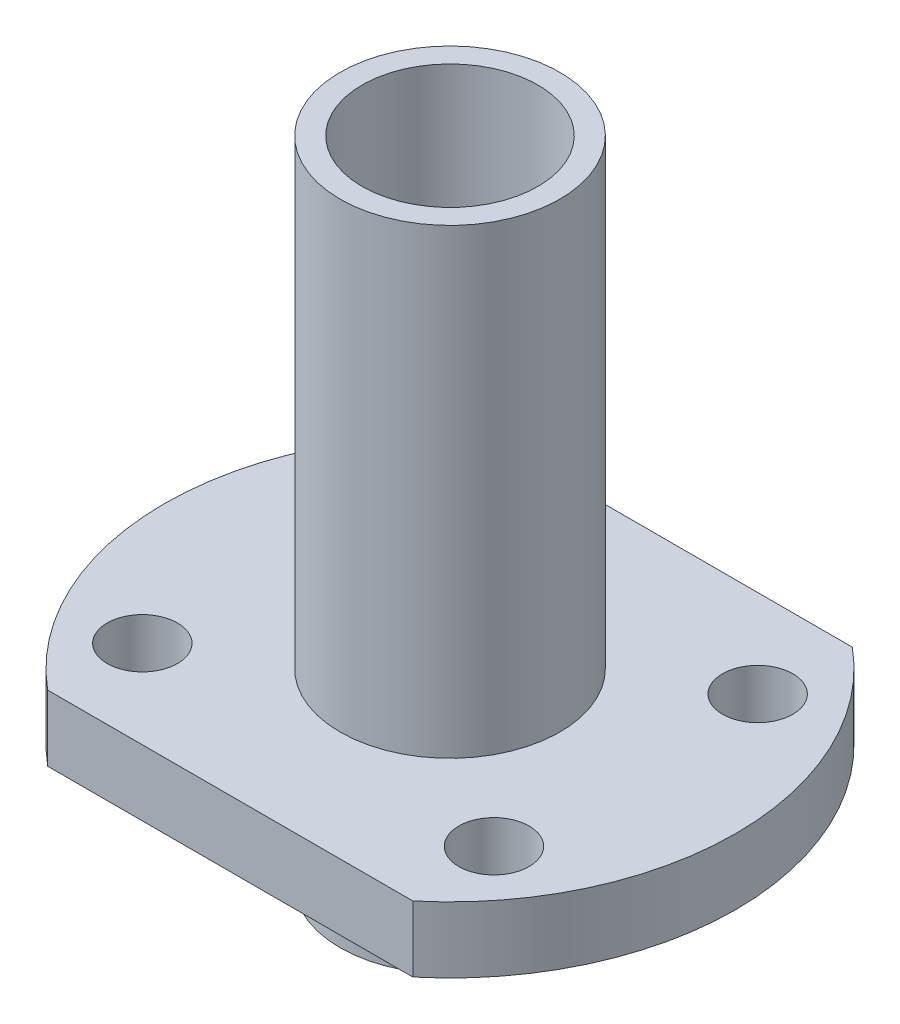
ISO-10303-21;
HEADER;
FILE_DESCRIPTION(('STEP AP214'),'2;1');
FILE_NAME('part.step','',(''),(''),'','','');
FILE_SCHEMA(('AUTOMOTIVE_DESIGN { 1 0 10303 214 1 1 1 1 }'));
ENDSEC;
DATA;
#1=APPLICATION_CONTEXT('core data for automotive mechanical design processes');
#2=APPLICATION_PROTOCOL_DEFINITION('international standard','automotive_design',2000,#1);
#3=PRODUCT_CONTEXT('',#1,'mechanical');
#4=PRODUCT('Part','Part','',(#3));
#5=PRODUCT_RELATED_PRODUCT_CATEGORY('part','',(#4));
#6=PRODUCT_DEFINITION_FORMATION('','',#4);
#7=PRODUCT_DEFINITION_CONTEXT('part definition',#1,'design');
#8=PRODUCT_DEFINITION('design','',#6,#7);
#9=PRODUCT_DEFINITION_SHAPE('','',#8);
#10=(LENGTH_UNIT() NAMED_UNIT(*) SI_UNIT(.MILLI.,.METRE.));
#11=(NAMED_UNIT(*) PLANE_ANGLE_UNIT() SI_UNIT($,.RADIAN.));
#12=(NAMED_UNIT(*) SI_UNIT($,.STERADIAN.) SOLID_ANGLE_UNIT());
#13=UNCERTAINTY_MEASURE_WITH_UNIT(LENGTH_MEASURE(1.E-05),#10,'distance_accuracy_value','');
#14=(GEOMETRIC_REPRESENTATION_CONTEXT(3) GLOBAL_UNCERTAINTY_ASSIGNED_CONTEXT((#13)) GLOBAL_UNIT_ASSIGNED_CONTEXT((#10,
#11,#12)) REPRESENTATION_CONTEXT('',''));
#15=CARTESIAN_POINT('',(0.,0.,0.));
#16=DIRECTION('',(0.,0.,1.));
#17=DIRECTION('',(1.,0.,0.));
#18=AXIS2_PLACEMENT_3D('',#15,#16,#17);
#19=CARTESIAN_POINT('',(0.,29.5,0.));
#20=DIRECTION('',(0.,-1.,0.));
#21=DIRECTION('',(0.,0.,-1.));
#22=AXIS2_PLACEMENT_3D('',#19,#20,#21);
#23=CYLINDRICAL_SURFACE('',#22,5.);
#24=CARTESIAN_POINT('',(0.,8.5,0.));
#25=DIRECTION('',(0.,1.,0.));
#26=DIRECTION('',(0.,0.,1.));
#27=AXIS2_PLACEMENT_3D('',#24,#25,#26);
#28=CIRCLE('',#27,5.);
#29=CARTESIAN_POINT('',(0.,8.5,5.));
#30=VERTEX_POINT('',#29);
#31=EDGE_CURVE('E109',#30,#30,#28,.T.);
#32=ORIENTED_EDGE('',*,*,#31,.T.);
#33=EDGE_LOOP('',(#32));
#34=FACE_BOUND('',#33,.T.);
#35=CARTESIAN_POINT('',(0.,29.5,0.));
#36=DIRECTION('',(0.,1.,0.));
#37=DIRECTION('',(0.,0.,1.));
#38=AXIS2_PLACEMENT_3D('',#35,#36,#37);
#39=CIRCLE('',#38,5.);
#40=CARTESIAN_POINT('',(0.,29.5,5.));
#41=VERTEX_POINT('',#40);
#42=EDGE_CURVE('E41',#41,#41,#39,.T.);
#43=ORIENTED_EDGE('',*,*,#42,.F.);
#44=EDGE_LOOP('',(#43));
#45=FACE_BOUND('',#44,.T.);
#46=ADVANCED_FACE('F32',(#34,#45),#23,.T.);
#47=CARTESIAN_POINT('',(0.,29.5,0.));
#48=DIRECTION('',(0.,1.,0.));
#49=DIRECTION('',(0.,0.,1.));
#50=AXIS2_PLACEMENT_3D('',#47,#48,#49);
#51=PLANE('',#50);
#52=CARTESIAN_POINT('',(0.,29.5,0.));
#53=DIRECTION('',(0.,1.,0.));
#54=DIRECTION('',(0.,0.,1.));
#55=AXIS2_PLACEMENT_3D('',#52,#53,#54);
#56=CIRCLE('',#55,4.);
#57=CARTESIAN_POINT('',(0.,29.5,4.));
#58=VERTEX_POINT('',#57);
#59=EDGE_CURVE('E119',#58,#58,#56,.T.);
#60=ORIENTED_EDGE('',*,*,#59,.F.);
#61=EDGE_LOOP('',(#60));
#62=FACE_BOUND('',#61,.T.);
#63=ORIENTED_EDGE('',*,*,#42,.T.);
#64=EDGE_LOOP('',(#63));
#65=FACE_BOUND('',#64,.T.);
#66=ADVANCED_FACE('F144',(#62,#65),#51,.T.);
#67=CARTESIAN_POINT('',(0.,8.5,10.));
#68=DIRECTION('',(0.,0.,-1.));
#69=DIRECTION('',(-1.,0.,0.));
#70=AXIS2_PLACEMENT_3D('',#67,#68,#69);
#71=PLANE('',#70);
#72=DIRECTION('',(1.,0.,0.));
#73=VECTOR('',#72,1.);
#74=CARTESIAN_POINT('',(0.,5.5,10.));
#75=LINE('',#74,#73);
#76=CARTESIAN_POINT('',(-8.30662386291808,5.5,10.));
#77=VERTEX_POINT('',#76);
#78=CARTESIAN_POINT('',(8.30662386291808,5.5,10.));
#79=VERTEX_POINT('',#78);
#80=EDGE_CURVE('E99',#77,#79,#75,.T.);
#81=ORIENTED_EDGE('',*,*,#80,.T.);
#82=DIRECTION('',(0.,-1.,0.));
#83=VECTOR('',#82,1.);
#84=CARTESIAN_POINT('',(8.30662386291808,8.5,10.));
#85=LINE('',#84,#83);
#86=CARTESIAN_POINT('',(8.30662386291808,8.5,10.));
#87=VERTEX_POINT('',#86);
#88=EDGE_CURVE('E92',#87,#79,#85,.T.);
#89=ORIENTED_EDGE('',*,*,#88,.F.);
#90=DIRECTION('',(1.,0.,0.));
#91=VECTOR('',#90,1.);
#92=CARTESIAN_POINT('',(0.,8.5,10.));
#93=LINE('',#92,#91);
#94=CARTESIAN_POINT('',(-8.30662386291808,8.5,10.));
#95=VERTEX_POINT('',#94);
#96=EDGE_CURVE('E82',#95,#87,#93,.T.);
#97=ORIENTED_EDGE('',*,*,#96,.F.);
#98=DIRECTION('',(0.,-1.,0.));
#99=VECTOR('',#98,1.);
#100=CARTESIAN_POINT('',(-8.30662386291808,8.5,10.));
#101=LINE('',#100,#99);
#102=EDGE_CURVE('E96',#95,#77,#101,.T.);
#103=ORIENTED_EDGE('',*,*,#102,.T.);
#104=EDGE_LOOP('',(#81,#89,#97,#103));
#105=FACE_BOUND('',#104,.T.);
#106=ADVANCED_FACE('F147',(#105),#71,.F.);
#107=CARTESIAN_POINT('',(0.,8.5,0.));
#108=DIRECTION('',(0.,-1.,0.));
#109=DIRECTION('',(0.,0.,-1.));
#110=AXIS2_PLACEMENT_3D('',#107,#108,#109);
#111=CYLINDRICAL_SURFACE('',#110,13.);
#112=CARTESIAN_POINT('',(0.,5.5,0.));
#113=DIRECTION('',(0.,1.,0.));
#114=DIRECTION('',(0.,0.,1.));
#115=AXIS2_PLACEMENT_3D('',#112,#113,#114);
#116=CIRCLE('',#115,13.);
#117=CARTESIAN_POINT('',(8.30662386291808,5.5,-10.));
#118=VERTEX_POINT('',#117);
#119=EDGE_CURVE('E88',#79,#118,#116,.T.);
#120=ORIENTED_EDGE('',*,*,#119,.T.);
#121=DIRECTION('',(0.,-1.,0.));
#122=VECTOR('',#121,1.);
#123=CARTESIAN_POINT('',(8.30662386291808,8.5,-10.));
#124=LINE('',#123,#122);
#125=CARTESIAN_POINT('',(8.30662386291808,8.5,-10.));
#126=VERTEX_POINT('',#125);
#127=EDGE_CURVE('E86',#126,#118,#124,.T.);
#128=ORIENTED_EDGE('',*,*,#127,.F.);
#129=CARTESIAN_POINT('',(0.,8.5,0.));
#130=DIRECTION('',(0.,1.,0.));
#131=DIRECTION('',(0.,0.,1.));
#132=AXIS2_PLACEMENT_3D('',#129,#130,#131);
#133=CIRCLE('',#132,13.);
#134=EDGE_CURVE('E77',#87,#126,#133,.T.);
#135=ORIENTED_EDGE('',*,*,#134,.F.);
#136=ORIENTED_EDGE('',*,*,#88,.T.);
#137=EDGE_LOOP('',(#120,#128,#135,#136));
#138=FACE_BOUND('',#137,.T.);
#139=ADVANCED_FACE('F87',(#138),#111,.T.);
#140=CARTESIAN_POINT('',(0.,8.5,-10.));
#141=DIRECTION('',(0.,0.,-1.));
#142=DIRECTION('',(-1.,0.,0.));
#143=AXIS2_PLACEMENT_3D('',#140,#141,#142);
#144=PLANE('',#143);
#145=DIRECTION('',(1.,0.,0.));
#146=VECTOR('',#145,1.);
#147=CARTESIAN_POINT('',(0.,5.5,-10.));
#148=LINE('',#147,#146);
#149=CARTESIAN_POINT('',(-8.30662386291808,5.5,-10.));
#150=VERTEX_POINT('',#149);
#151=EDGE_CURVE('E104',#150,#118,#148,.T.);
#152=ORIENTED_EDGE('',*,*,#151,.F.);
#153=DIRECTION('',(0.,-1.,0.));
#154=VECTOR('',#153,1.);
#155=CARTESIAN_POINT('',(-8.30662386291808,8.5,-10.));
#156=LINE('',#155,#154);
#157=CARTESIAN_POINT('',(-8.30662386291808,8.5,-10.));
#158=VERTEX_POINT('',#157);
#159=EDGE_CURVE('E66',#158,#150,#156,.T.);
#160=ORIENTED_EDGE('',*,*,#159,.F.);
#161=DIRECTION('',(1.,0.,0.));
#162=VECTOR('',#161,1.);
#163=CARTESIAN_POINT('',(0.,8.5,-10.));
#164=LINE('',#163,#162);
#165=EDGE_CURVE('E80',#158,#126,#164,.T.);
#166=ORIENTED_EDGE('',*,*,#165,.T.);
#167=ORIENTED_EDGE('',*,*,#127,.T.);
#168=EDGE_LOOP('',(#152,#160,#166,#167));
#169=FACE_BOUND('',#168,.T.);
#170=ADVANCED_FACE('F94',(#169),#144,.T.);
#171=EDGE_CURVE('E69',#150,#77,#116,.T.);
#172=ORIENTED_EDGE('',*,*,#171,.T.);
#173=ORIENTED_EDGE('',*,*,#102,.F.);
#174=EDGE_CURVE('E50',#158,#95,#133,.T.);
#175=ORIENTED_EDGE('',*,*,#174,.F.);
#176=ORIENTED_EDGE('',*,*,#159,.T.);
#177=EDGE_LOOP('',(#172,#173,#175,#176));
#178=FACE_BOUND('',#177,.T.);
#179=ADVANCED_FACE('F178',(#178),#111,.T.);
#180=CARTESIAN_POINT('',(0.,8.5,0.));
#181=DIRECTION('',(0.,1.,0.));
#182=DIRECTION('',(0.,0.,1.));
#183=AXIS2_PLACEMENT_3D('',#180,#181,#182);
#184=PLANE('',#183);
#185=CARTESIAN_POINT('',(8.,8.5,6.));
#186=DIRECTION('',(0.,1.,0.));
#187=DIRECTION('',(0.,0.,1.));
#188=AXIS2_PLACEMENT_3D('',#185,#186,#187);
#189=CIRCLE('',#188,1.6);
#190=CARTESIAN_POINT('',(8.,8.5,7.6));
#191=VERTEX_POINT('',#190);
#192=EDGE_CURVE('E272',#191,#191,#189,.T.);
#193=ORIENTED_EDGE('',*,*,#192,.F.);
#194=EDGE_LOOP('',(#193));
#195=FACE_BOUND('',#194,.T.);
#196=CARTESIAN_POINT('',(8.,8.5,-6.));
#197=DIRECTION('',(0.,1.,0.));
#198=DIRECTION('',(0.,0.,1.));
#199=AXIS2_PLACEMENT_3D('',#196,#197,#198);
#200=CIRCLE('',#199,1.6);
#201=CARTESIAN_POINT('',(8.,8.5,-4.4));
#202=VERTEX_POINT('',#201);
#203=EDGE_CURVE('E133',#202,#202,#200,.T.);
#204=ORIENTED_EDGE('',*,*,#203,.F.);
#205=EDGE_LOOP('',(#204));
#206=FACE_BOUND('',#205,.T.);
#207=CARTESIAN_POINT('',(-8.,8.5,-6.));
#208=DIRECTION('',(0.,1.,0.));
#209=DIRECTION('',(0.,0.,1.));
#210=AXIS2_PLACEMENT_3D('',#207,#208,#209);
#211=CIRCLE('',#210,1.6);
#212=CARTESIAN_POINT('',(-8.,8.5,-4.4));
#213=VERTEX_POINT('',#212);
#214=EDGE_CURVE('E123',#213,#213,#211,.T.);
#215=ORIENTED_EDGE('',*,*,#214,.F.);
#216=EDGE_LOOP('',(#215));
#217=FACE_BOUND('',#216,.T.);
#218=CARTESIAN_POINT('',(-8.,8.5,6.));
#219=DIRECTION('',(0.,1.,0.));
#220=DIRECTION('',(0.,0.,1.));
#221=AXIS2_PLACEMENT_3D('',#218,#219,#220);
#222=CIRCLE('',#221,1.6);
#223=CARTESIAN_POINT('',(-8.,8.5,7.6));
#224=VERTEX_POINT('',#223);
#225=EDGE_CURVE('E120',#224,#224,#222,.T.);
#226=ORIENTED_EDGE('',*,*,#225,.F.);
#227=EDGE_LOOP('',(#226));
#228=FACE_BOUND('',#227,.T.);
#229=ORIENTED_EDGE('',*,*,#31,.F.);
#230=EDGE_LOOP('',(#229));
#231=FACE_BOUND('',#230,.T.);
#232=ORIENTED_EDGE('',*,*,#96,.T.);
#233=ORIENTED_EDGE('',*,*,#134,.T.);
#234=ORIENTED_EDGE('',*,*,#165,.F.);
#235=ORIENTED_EDGE('',*,*,#174,.T.);
#236=EDGE_LOOP('',(#232,#233,#234,#235));
#237=FACE_BOUND('',#236,.T.);
#238=ADVANCED_FACE('F78',(#195,#206,#217,#228,#231,#237),#184,.T.);
#239=CARTESIAN_POINT('',(0.,5.5,0.));
#240=DIRECTION('',(0.,1.,0.));
#241=DIRECTION('',(0.,0.,1.));
#242=AXIS2_PLACEMENT_3D('',#239,#240,#241);
#243=PLANE('',#242);
#244=CARTESIAN_POINT('',(8.,5.5,6.));
#245=DIRECTION('',(0.,1.,0.));
#246=DIRECTION('',(0.,0.,1.));
#247=AXIS2_PLACEMENT_3D('',#244,#245,#246);
#248=CIRCLE('',#247,1.6);
#249=CARTESIAN_POINT('',(8.,5.5,7.6));
#250=VERTEX_POINT('',#249);
#251=EDGE_CURVE('E275',#250,#250,#248,.T.);
#252=ORIENTED_EDGE('',*,*,#251,.T.);
#253=EDGE_LOOP('',(#252));
#254=FACE_BOUND('',#253,.T.);
#255=CARTESIAN_POINT('',(8.,5.5,-6.));
#256=DIRECTION('',(0.,1.,0.));
#257=DIRECTION('',(0.,0.,1.));
#258=AXIS2_PLACEMENT_3D('',#255,#256,#257);
#259=CIRCLE('',#258,1.6);
#260=CARTESIAN_POINT('',(8.,5.5,-4.4));
#261=VERTEX_POINT('',#260);
#262=EDGE_CURVE('E35',#261,#261,#259,.T.);
#263=ORIENTED_EDGE('',*,*,#262,.T.);
#264=EDGE_LOOP('',(#263));
#265=FACE_BOUND('',#264,.T.);
#266=CARTESIAN_POINT('',(-8.,5.5,-6.));
#267=DIRECTION('',(0.,1.,0.));
#268=DIRECTION('',(0.,0.,1.));
#269=AXIS2_PLACEMENT_3D('',#266,#267,#268);
#270=CIRCLE('',#269,1.6);
#271=CARTESIAN_POINT('',(-8.,5.5,-4.4));
#272=VERTEX_POINT('',#271);
#273=EDGE_CURVE('E121',#272,#272,#270,.T.);
#274=ORIENTED_EDGE('',*,*,#273,.T.);
#275=EDGE_LOOP('',(#274));
#276=FACE_BOUND('',#275,.T.);
#277=CARTESIAN_POINT('',(-8.,5.5,6.));
#278=DIRECTION('',(0.,1.,0.));
#279=DIRECTION('',(0.,0.,1.));
#280=AXIS2_PLACEMENT_3D('',#277,#278,#279);
#281=CIRCLE('',#280,1.6);
#282=CARTESIAN_POINT('',(-8.,5.5,7.6));
#283=VERTEX_POINT('',#282);
#284=EDGE_CURVE('E117',#283,#283,#281,.T.);
#285=ORIENTED_EDGE('',*,*,#284,.T.);
#286=EDGE_LOOP('',(#285));
#287=FACE_BOUND('',#286,.T.);
#288=CARTESIAN_POINT('',(0.,5.5,0.));
#289=DIRECTION('',(0.,1.,0.));
#290=DIRECTION('',(0.,0.,1.));
#291=AXIS2_PLACEMENT_3D('',#288,#289,#290);
#292=CIRCLE('',#291,5.);
#293=CARTESIAN_POINT('',(0.,5.5,5.));
#294=VERTEX_POINT('',#293);
#295=EDGE_CURVE('E11',#294,#294,#292,.T.);
#296=ORIENTED_EDGE('',*,*,#295,.T.);
#297=EDGE_LOOP('',(#296));
#298=FACE_BOUND('',#297,.T.);
#299=ORIENTED_EDGE('',*,*,#80,.F.);
#300=ORIENTED_EDGE('',*,*,#171,.F.);
#301=ORIENTED_EDGE('',*,*,#151,.T.);
#302=ORIENTED_EDGE('',*,*,#119,.F.);
#303=EDGE_LOOP('',(#299,#300,#301,#302));
#304=FACE_BOUND('',#303,.T.);
#305=ADVANCED_FACE('F166',(#254,#265,#276,#287,#298,#304),#243,.F.);
#306=CARTESIAN_POINT('',(0.,0.,0.));
#307=DIRECTION('',(0.,1.,0.));
#308=DIRECTION('',(0.,0.,1.));
#309=AXIS2_PLACEMENT_3D('',#306,#307,#308);
#310=PLANE('',#309);
#311=CARTESIAN_POINT('',(0.,0.,0.));
#312=DIRECTION('',(0.,1.,0.));
#313=DIRECTION('',(0.,0.,1.));
#314=AXIS2_PLACEMENT_3D('',#311,#312,#313);
#315=CIRCLE('',#314,4.);
#316=CARTESIAN_POINT('',(0.,0.,4.));
#317=VERTEX_POINT('',#316);
#318=EDGE_CURVE('E102',#317,#317,#315,.T.);
#319=ORIENTED_EDGE('',*,*,#318,.T.);
#320=EDGE_LOOP('',(#319));
#321=FACE_BOUND('',#320,.T.);
#322=CARTESIAN_POINT('',(0.,0.,0.));
#323=DIRECTION('',(0.,1.,0.));
#324=DIRECTION('',(0.,0.,1.));
#325=AXIS2_PLACEMENT_3D('',#322,#323,#324);
#326=CIRCLE('',#325,5.);
#327=CARTESIAN_POINT('',(0.,0.,5.));
#328=VERTEX_POINT('',#327);
#329=EDGE_CURVE('E112',#328,#328,#326,.T.);
#330=ORIENTED_EDGE('',*,*,#329,.F.);
#331=EDGE_LOOP('',(#330));
#332=FACE_BOUND('',#331,.T.);
#333=ADVANCED_FACE('F157',(#321,#332),#310,.F.);
#334=ORIENTED_EDGE('',*,*,#329,.T.);
#335=EDGE_LOOP('',(#334));
#336=FACE_BOUND('',#335,.T.);
#337=ORIENTED_EDGE('',*,*,#295,.F.);
#338=EDGE_LOOP('',(#337));
#339=FACE_BOUND('',#338,.T.);
#340=ADVANCED_FACE('F153',(#336,#339),#23,.T.);
#341=CARTESIAN_POINT('',(0.,0.,0.));
#342=DIRECTION('',(0.,1.,0.));
#343=DIRECTION('',(0.,0.,1.));
#344=AXIS2_PLACEMENT_3D('',#341,#342,#343);
#345=CYLINDRICAL_SURFACE('',#344,4.);
#346=ORIENTED_EDGE('',*,*,#318,.F.);
#347=EDGE_LOOP('',(#346));
#348=FACE_BOUND('',#347,.T.);
#349=ORIENTED_EDGE('',*,*,#59,.T.);
#350=EDGE_LOOP('',(#349));
#351=FACE_BOUND('',#350,.T.);
#352=ADVANCED_FACE('F142',(#348,#351),#345,.F.);
#353=CARTESIAN_POINT('',(-8.,8.5,6.));
#354=DIRECTION('',(0.,1.,0.));
#355=DIRECTION('',(0.,0.,1.));
#356=AXIS2_PLACEMENT_3D('',#353,#354,#355);
#357=CYLINDRICAL_SURFACE('',#356,1.6);
#358=ORIENTED_EDGE('',*,*,#225,.T.);
#359=EDGE_LOOP('',(#358));
#360=FACE_BOUND('',#359,.T.);
#361=ORIENTED_EDGE('',*,*,#284,.F.);
#362=EDGE_LOOP('',(#361));
#363=FACE_BOUND('',#362,.T.);
#364=ADVANCED_FACE('F163',(#360,#363),#357,.F.);
#365=CARTESIAN_POINT('',(-8.,8.5,-6.));
#366=DIRECTION('',(0.,1.,0.));
#367=DIRECTION('',(0.,0.,1.));
#368=AXIS2_PLACEMENT_3D('',#365,#366,#367);
#369=CYLINDRICAL_SURFACE('',#368,1.6);
#370=ORIENTED_EDGE('',*,*,#214,.T.);
#371=EDGE_LOOP('',(#370));
#372=FACE_BOUND('',#371,.T.);
#373=ORIENTED_EDGE('',*,*,#273,.F.);
#374=EDGE_LOOP('',(#373));
#375=FACE_BOUND('',#374,.T.);
#376=ADVANCED_FACE('F236',(#372,#375),#369,.F.);
#377=CARTESIAN_POINT('',(8.,8.5,-6.));
#378=DIRECTION('',(0.,1.,0.));
#379=DIRECTION('',(0.,0.,1.));
#380=AXIS2_PLACEMENT_3D('',#377,#378,#379);
#381=CYLINDRICAL_SURFACE('',#380,1.6);
#382=ORIENTED_EDGE('',*,*,#203,.T.);
#383=EDGE_LOOP('',(#382));
#384=FACE_BOUND('',#383,.T.);
#385=ORIENTED_EDGE('',*,*,#262,.F.);
#386=EDGE_LOOP('',(#385));
#387=FACE_BOUND('',#386,.T.);
#388=ADVANCED_FACE('F246',(#384,#387),#381,.F.);
#389=CARTESIAN_POINT('',(8.,8.5,6.));
#390=DIRECTION('',(0.,1.,0.));
#391=DIRECTION('',(0.,0.,1.));
#392=AXIS2_PLACEMENT_3D('',#389,#390,#391);
#393=CYLINDRICAL_SURFACE('',#392,1.6);
#394=ORIENTED_EDGE('',*,*,#192,.T.);
#395=EDGE_LOOP('',(#394));
#396=FACE_BOUND('',#395,.T.);
#397=ORIENTED_EDGE('',*,*,#251,.F.);
#398=EDGE_LOOP('',(#397));
#399=FACE_BOUND('',#398,.T.);
#400=ADVANCED_FACE('F255',(#396,#399),#393,.F.);
#401=CLOSED_SHELL('',(#46,#66,#106,#139,#170,#179,#238,#305,#333,#340,#352,#364,#376,#388,#400));
#402=MANIFOLD_SOLID_BREP('B2',#401);
#403=ADVANCED_BREP_SHAPE_REPRESENTATION('',(#18,#402),#14);
#404=SHAPE_DEFINITION_REPRESENTATION(#9,#403);
ENDSEC;
END-ISO-10303-21;
